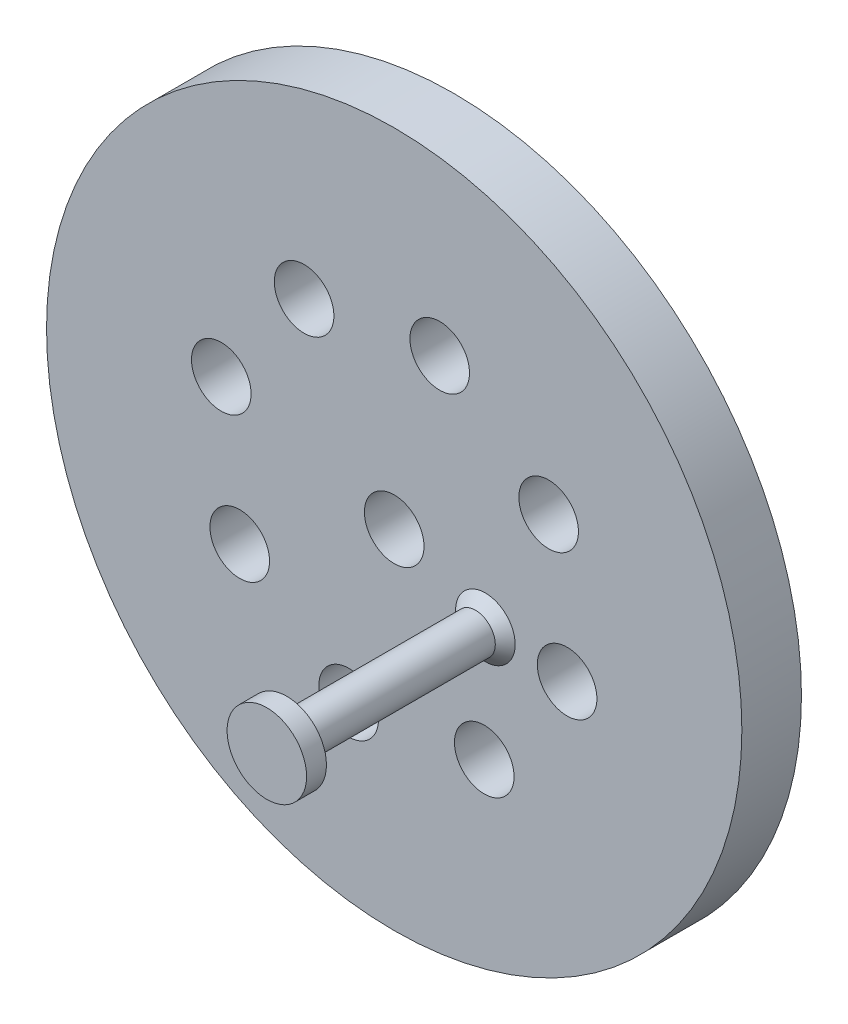
ISO-10303-21;
HEADER;
FILE_DESCRIPTION(('STEP AP214'),'2;1');
FILE_NAME('part.step','',(''),(''),'','','');
FILE_SCHEMA(('AUTOMOTIVE_DESIGN { 1 0 10303 214 1 1 1 1 }'));
ENDSEC;
DATA;
#1=APPLICATION_CONTEXT('core data for automotive mechanical design processes');
#2=APPLICATION_PROTOCOL_DEFINITION('international standard','automotive_design',2000,#1);
#3=PRODUCT_CONTEXT('',#1,'mechanical');
#4=PRODUCT('Part','Part','',(#3));
#5=PRODUCT_RELATED_PRODUCT_CATEGORY('part','',(#4));
#6=PRODUCT_DEFINITION_FORMATION('','',#4);
#7=PRODUCT_DEFINITION_CONTEXT('part definition',#1,'design');
#8=PRODUCT_DEFINITION('design','',#6,#7);
#9=PRODUCT_DEFINITION_SHAPE('','',#8);
#10=(LENGTH_UNIT() NAMED_UNIT(*) SI_UNIT(.MILLI.,.METRE.));
#11=(NAMED_UNIT(*) PLANE_ANGLE_UNIT() SI_UNIT($,.RADIAN.));
#12=(NAMED_UNIT(*) SI_UNIT($,.STERADIAN.) SOLID_ANGLE_UNIT());
#13=UNCERTAINTY_MEASURE_WITH_UNIT(LENGTH_MEASURE(1.E-05),#10,'distance_accuracy_value','');
#14=(GEOMETRIC_REPRESENTATION_CONTEXT(3) GLOBAL_UNCERTAINTY_ASSIGNED_CONTEXT((#13)) GLOBAL_UNIT_ASSIGNED_CONTEXT((#10,
#11,#12)) REPRESENTATION_CONTEXT('',''));
#15=CARTESIAN_POINT('',(0.,0.,0.));
#16=DIRECTION('',(0.,0.,1.));
#17=DIRECTION('',(1.,0.,0.));
#18=AXIS2_PLACEMENT_3D('',#15,#16,#17);
#19=CARTESIAN_POINT('',(9.17867077053944,-3.96887929849786,28.));
#20=DIRECTION('',(0.,0.,-1.));
#21=DIRECTION('',(-1.,0.,0.));
#22=AXIS2_PLACEMENT_3D('',#19,#20,#21);
#23=CYLINDRICAL_SURFACE('',#22,2.);
#24=CARTESIAN_POINT('',(9.17867077053944,-3.96887929849786,6.99999999999997));
#25=DIRECTION('',(0.,0.,1.));
#26=DIRECTION('',(1.,0.,0.));
#27=AXIS2_PLACEMENT_3D('',#24,#25,#26);
#28=CIRCLE('',#27,2.);
#29=CARTESIAN_POINT('',(11.1786707705394,-3.96887929849786,6.99999999999997));
#30=VERTEX_POINT('',#29);
#31=EDGE_CURVE('E67',#30,#30,#28,.T.);
#32=ORIENTED_EDGE('',*,*,#31,.T.);
#33=EDGE_LOOP('',(#32));
#34=FACE_BOUND('',#33,.T.);
#35=CARTESIAN_POINT('',(9.17867077053944,-3.96887929849786,26.));
#36=DIRECTION('',(0.,0.,1.));
#37=DIRECTION('',(1.,0.,0.));
#38=AXIS2_PLACEMENT_3D('',#35,#36,#37);
#39=CIRCLE('',#38,2.);
#40=CARTESIAN_POINT('',(11.1786707705394,-3.96887929849786,26.));
#41=VERTEX_POINT('',#40);
#42=EDGE_CURVE('E74',#41,#41,#39,.T.);
#43=ORIENTED_EDGE('',*,*,#42,.F.);
#44=EDGE_LOOP('',(#43));
#45=FACE_BOUND('',#44,.T.);
#46=ADVANCED_FACE('F58',(#34,#45),#23,.T.);
#47=CARTESIAN_POINT('',(0.,0.,6.));
#48=DIRECTION('',(0.,0.,1.));
#49=DIRECTION('',(1.,0.,0.));
#50=AXIS2_PLACEMENT_3D('',#47,#48,#49);
#51=PLANE('',#50);
#52=CARTESIAN_POINT('',(9.17867077053944,-3.96887929849786,6.));
#53=DIRECTION('',(0.,0.,1.));
#54=DIRECTION('',(1.,0.,0.));
#55=AXIS2_PLACEMENT_3D('',#52,#53,#54);
#56=CIRCLE('',#55,2.99999999999996);
#57=CARTESIAN_POINT('',(12.1786707705394,-3.96887929849786,6.));
#58=VERTEX_POINT('',#57);
#59=EDGE_CURVE('E10',#58,#58,#56,.F.);
#60=ORIENTED_EDGE('',*,*,#59,.T.);
#61=EDGE_LOOP('',(#60));
#62=FACE_BOUND('',#61,.T.);
#63=CARTESIAN_POINT('',(15.548658842396,9.06858358305098,6.));
#64=DIRECTION('',(0.,0.,-1.));
#65=DIRECTION('',(-1.,0.,0.));
#66=AXIS2_PLACEMENT_3D('',#63,#64,#65);
#67=CIRCLE('',#66,3.);
#68=CARTESIAN_POINT('',(12.548658842396,9.06858358305098,6.));
#69=VERTEX_POINT('',#68);
#70=EDGE_CURVE('E108',#69,#69,#67,.T.);
#71=ORIENTED_EDGE('',*,*,#70,.T.);
#72=EDGE_LOOP('',(#71));
#73=FACE_BOUND('',#72,.T.);
#74=CARTESIAN_POINT('',(17.4070190531467,-4.58210515848203,6.));
#75=DIRECTION('',(0.,0.,-1.));
#76=DIRECTION('',(-1.,0.,0.));
#77=AXIS2_PLACEMENT_3D('',#74,#75,#76);
#78=CIRCLE('',#77,3.);
#79=CARTESIAN_POINT('',(14.4070190531467,-4.58210515848203,6.));
#80=VERTEX_POINT('',#79);
#81=EDGE_CURVE('E117',#80,#80,#78,.T.);
#82=ORIENTED_EDGE('',*,*,#81,.T.);
#83=EDGE_LOOP('',(#82));
#84=FACE_BOUND('',#83,.T.);
#85=CARTESIAN_POINT('',(9.06858358305099,-15.5486588423959,6.));
#86=DIRECTION('',(0.,0.,-1.));
#87=DIRECTION('',(-1.,0.,0.));
#88=AXIS2_PLACEMENT_3D('',#85,#86,#87);
#89=CIRCLE('',#88,3.);
#90=CARTESIAN_POINT('',(6.06858358305099,-15.5486588423959,6.));
#91=VERTEX_POINT('',#90);
#92=EDGE_CURVE('E125',#91,#91,#89,.T.);
#93=ORIENTED_EDGE('',*,*,#92,.T.);
#94=EDGE_LOOP('',(#93));
#95=FACE_BOUND('',#94,.T.);
#96=CARTESIAN_POINT('',(-4.58210515848203,-17.4070190531467,6.));
#97=DIRECTION('',(0.,0.,-1.));
#98=DIRECTION('',(-1.,0.,0.));
#99=AXIS2_PLACEMENT_3D('',#96,#97,#98);
#100=CIRCLE('',#99,3.);
#101=CARTESIAN_POINT('',(-7.58210515848203,-17.4070190531467,6.));
#102=VERTEX_POINT('',#101);
#103=EDGE_CURVE('E133',#102,#102,#100,.T.);
#104=ORIENTED_EDGE('',*,*,#103,.T.);
#105=EDGE_LOOP('',(#104));
#106=FACE_BOUND('',#105,.T.);
#107=CARTESIAN_POINT('',(-15.548658842396,-9.06858358305097,6.));
#108=DIRECTION('',(0.,0.,-1.));
#109=DIRECTION('',(-1.,0.,0.));
#110=AXIS2_PLACEMENT_3D('',#107,#108,#109);
#111=CIRCLE('',#110,3.);
#112=CARTESIAN_POINT('',(-18.548658842396,-9.06858358305097,6.));
#113=VERTEX_POINT('',#112);
#114=EDGE_CURVE('E141',#113,#113,#111,.T.);
#115=ORIENTED_EDGE('',*,*,#114,.T.);
#116=EDGE_LOOP('',(#115));
#117=FACE_BOUND('',#116,.T.);
#118=CARTESIAN_POINT('',(-17.4070190531467,4.58210515848202,6.));
#119=DIRECTION('',(0.,0.,-1.));
#120=DIRECTION('',(-1.,0.,0.));
#121=AXIS2_PLACEMENT_3D('',#118,#119,#120);
#122=CIRCLE('',#121,2.99999999999999);
#123=CARTESIAN_POINT('',(-20.4070190531467,4.58210515848202,6.));
#124=VERTEX_POINT('',#123);
#125=EDGE_CURVE('E149',#124,#124,#122,.T.);
#126=ORIENTED_EDGE('',*,*,#125,.T.);
#127=EDGE_LOOP('',(#126));
#128=FACE_BOUND('',#127,.T.);
#129=CARTESIAN_POINT('',(-9.06858358305098,15.548658842396,6.));
#130=DIRECTION('',(0.,0.,-1.));
#131=DIRECTION('',(-1.,0.,0.));
#132=AXIS2_PLACEMENT_3D('',#129,#130,#131);
#133=CIRCLE('',#132,3.);
#134=CARTESIAN_POINT('',(-12.068583583051,15.548658842396,6.));
#135=VERTEX_POINT('',#134);
#136=EDGE_CURVE('E157',#135,#135,#133,.T.);
#137=ORIENTED_EDGE('',*,*,#136,.T.);
#138=EDGE_LOOP('',(#137));
#139=FACE_BOUND('',#138,.T.);
#140=CARTESIAN_POINT('',(4.58210515848201,17.4070190531467,6.));
#141=DIRECTION('',(0.,0.,-1.));
#142=DIRECTION('',(-1.,0.,0.));
#143=AXIS2_PLACEMENT_3D('',#140,#141,#142);
#144=CIRCLE('',#143,3.);
#145=CARTESIAN_POINT('',(1.58210515848201,17.4070190531467,6.));
#146=VERTEX_POINT('',#145);
#147=EDGE_CURVE('E96',#146,#146,#144,.T.);
#148=ORIENTED_EDGE('',*,*,#147,.T.);
#149=EDGE_LOOP('',(#148));
#150=FACE_BOUND('',#149,.T.);
#151=CARTESIAN_POINT('',(0.,0.,6.));
#152=DIRECTION('',(0.,0.,1.));
#153=DIRECTION('',(1.,0.,0.));
#154=AXIS2_PLACEMENT_3D('',#151,#152,#153);
#155=CIRCLE('',#154,35.);
#156=CARTESIAN_POINT('',(35.,0.,6.));
#157=VERTEX_POINT('',#156);
#158=EDGE_CURVE('E81',#157,#157,#155,.T.);
#159=ORIENTED_EDGE('',*,*,#158,.T.);
#160=EDGE_LOOP('',(#159));
#161=FACE_BOUND('',#160,.T.);
#162=CARTESIAN_POINT('',(0.,0.,6.));
#163=DIRECTION('',(0.,0.,1.));
#164=DIRECTION('',(1.,0.,0.));
#165=AXIS2_PLACEMENT_3D('',#162,#163,#164);
#166=CIRCLE('',#165,3.);
#167=CARTESIAN_POINT('',(3.,0.,6.));
#168=VERTEX_POINT('',#167);
#169=EDGE_CURVE('E88',#168,#168,#166,.T.);
#170=ORIENTED_EDGE('',*,*,#169,.F.);
#171=EDGE_LOOP('',(#170));
#172=FACE_BOUND('',#171,.T.);
#173=ADVANCED_FACE('F190',(#62,#73,#84,#95,#106,#117,#128,#139,#150,#161,#172),#51,.T.);
#174=CARTESIAN_POINT('',(0.,0.,0.));
#175=DIRECTION('',(0.,0.,1.));
#176=DIRECTION('',(1.,0.,0.));
#177=AXIS2_PLACEMENT_3D('',#174,#175,#176);
#178=PLANE('',#177);
#179=CARTESIAN_POINT('',(15.548658842396,9.06858358305098,0.));
#180=DIRECTION('',(0.,0.,-1.));
#181=DIRECTION('',(-1.,0.,0.));
#182=AXIS2_PLACEMENT_3D('',#179,#180,#181);
#183=CIRCLE('',#182,3.);
#184=CARTESIAN_POINT('',(12.548658842396,9.06858358305098,0.));
#185=VERTEX_POINT('',#184);
#186=EDGE_CURVE('E112',#185,#185,#183,.T.);
#187=ORIENTED_EDGE('',*,*,#186,.F.);
#188=EDGE_LOOP('',(#187));
#189=FACE_BOUND('',#188,.T.);
#190=CARTESIAN_POINT('',(17.4070190531467,-4.58210515848203,0.));
#191=DIRECTION('',(0.,0.,-1.));
#192=DIRECTION('',(-1.,0.,0.));
#193=AXIS2_PLACEMENT_3D('',#190,#191,#192);
#194=CIRCLE('',#193,3.);
#195=CARTESIAN_POINT('',(14.4070190531467,-4.58210515848203,0.));
#196=VERTEX_POINT('',#195);
#197=EDGE_CURVE('E121',#196,#196,#194,.T.);
#198=ORIENTED_EDGE('',*,*,#197,.F.);
#199=EDGE_LOOP('',(#198));
#200=FACE_BOUND('',#199,.T.);
#201=CARTESIAN_POINT('',(9.06858358305099,-15.5486588423959,0.));
#202=DIRECTION('',(0.,0.,-1.));
#203=DIRECTION('',(-1.,0.,0.));
#204=AXIS2_PLACEMENT_3D('',#201,#202,#203);
#205=CIRCLE('',#204,3.);
#206=CARTESIAN_POINT('',(6.06858358305099,-15.5486588423959,0.));
#207=VERTEX_POINT('',#206);
#208=EDGE_CURVE('E129',#207,#207,#205,.T.);
#209=ORIENTED_EDGE('',*,*,#208,.F.);
#210=EDGE_LOOP('',(#209));
#211=FACE_BOUND('',#210,.T.);
#212=CARTESIAN_POINT('',(-4.58210515848203,-17.4070190531467,0.));
#213=DIRECTION('',(0.,0.,-1.));
#214=DIRECTION('',(-1.,0.,0.));
#215=AXIS2_PLACEMENT_3D('',#212,#213,#214);
#216=CIRCLE('',#215,3.);
#217=CARTESIAN_POINT('',(-7.58210515848203,-17.4070190531467,0.));
#218=VERTEX_POINT('',#217);
#219=EDGE_CURVE('E137',#218,#218,#216,.T.);
#220=ORIENTED_EDGE('',*,*,#219,.F.);
#221=EDGE_LOOP('',(#220));
#222=FACE_BOUND('',#221,.T.);
#223=CARTESIAN_POINT('',(-15.548658842396,-9.06858358305097,0.));
#224=DIRECTION('',(0.,0.,-1.));
#225=DIRECTION('',(-1.,0.,0.));
#226=AXIS2_PLACEMENT_3D('',#223,#224,#225);
#227=CIRCLE('',#226,3.);
#228=CARTESIAN_POINT('',(-18.548658842396,-9.06858358305097,0.));
#229=VERTEX_POINT('',#228);
#230=EDGE_CURVE('E145',#229,#229,#227,.T.);
#231=ORIENTED_EDGE('',*,*,#230,.F.);
#232=EDGE_LOOP('',(#231));
#233=FACE_BOUND('',#232,.T.);
#234=CARTESIAN_POINT('',(-17.4070190531467,4.58210515848202,0.));
#235=DIRECTION('',(0.,0.,-1.));
#236=DIRECTION('',(-1.,0.,0.));
#237=AXIS2_PLACEMENT_3D('',#234,#235,#236);
#238=CIRCLE('',#237,2.99999999999999);
#239=CARTESIAN_POINT('',(-20.4070190531467,4.58210515848202,0.));
#240=VERTEX_POINT('',#239);
#241=EDGE_CURVE('E153',#240,#240,#238,.T.);
#242=ORIENTED_EDGE('',*,*,#241,.F.);
#243=EDGE_LOOP('',(#242));
#244=FACE_BOUND('',#243,.T.);
#245=CARTESIAN_POINT('',(-9.06858358305098,15.548658842396,0.));
#246=DIRECTION('',(0.,0.,-1.));
#247=DIRECTION('',(-1.,0.,0.));
#248=AXIS2_PLACEMENT_3D('',#245,#246,#247);
#249=CIRCLE('',#248,3.);
#250=CARTESIAN_POINT('',(-12.068583583051,15.548658842396,0.));
#251=VERTEX_POINT('',#250);
#252=EDGE_CURVE('E104',#251,#251,#249,.T.);
#253=ORIENTED_EDGE('',*,*,#252,.F.);
#254=EDGE_LOOP('',(#253));
#255=FACE_BOUND('',#254,.T.);
#256=CARTESIAN_POINT('',(4.58210515848201,17.4070190531467,0.));
#257=DIRECTION('',(0.,0.,-1.));
#258=DIRECTION('',(-1.,0.,0.));
#259=AXIS2_PLACEMENT_3D('',#256,#257,#258);
#260=CIRCLE('',#259,3.);
#261=CARTESIAN_POINT('',(1.58210515848201,17.4070190531467,0.));
#262=VERTEX_POINT('',#261);
#263=EDGE_CURVE('E100',#262,#262,#260,.T.);
#264=ORIENTED_EDGE('',*,*,#263,.F.);
#265=EDGE_LOOP('',(#264));
#266=FACE_BOUND('',#265,.T.);
#267=CARTESIAN_POINT('',(0.,0.,0.));
#268=DIRECTION('',(0.,0.,1.));
#269=DIRECTION('',(1.,0.,0.));
#270=AXIS2_PLACEMENT_3D('',#267,#268,#269);
#271=CIRCLE('',#270,35.);
#272=CARTESIAN_POINT('',(35.,0.,0.));
#273=VERTEX_POINT('',#272);
#274=EDGE_CURVE('E84',#273,#273,#271,.T.);
#275=ORIENTED_EDGE('',*,*,#274,.F.);
#276=EDGE_LOOP('',(#275));
#277=FACE_BOUND('',#276,.T.);
#278=CARTESIAN_POINT('',(0.,0.,0.));
#279=DIRECTION('',(0.,0.,1.));
#280=DIRECTION('',(1.,0.,0.));
#281=AXIS2_PLACEMENT_3D('',#278,#279,#280);
#282=CIRCLE('',#281,3.);
#283=CARTESIAN_POINT('',(3.,0.,0.));
#284=VERTEX_POINT('',#283);
#285=EDGE_CURVE('E92',#284,#284,#282,.T.);
#286=ORIENTED_EDGE('',*,*,#285,.T.);
#287=EDGE_LOOP('',(#286));
#288=FACE_BOUND('',#287,.T.);
#289=ADVANCED_FACE('F195',(#189,#200,#211,#222,#233,#244,#255,#266,#277,#288),#178,.F.);
#290=CARTESIAN_POINT('',(0.,0.,6.));
#291=DIRECTION('',(0.,0.,-1.));
#292=DIRECTION('',(-1.,0.,0.));
#293=AXIS2_PLACEMENT_3D('',#290,#291,#292);
#294=CYLINDRICAL_SURFACE('',#293,35.);
#295=ORIENTED_EDGE('',*,*,#158,.F.);
#296=EDGE_LOOP('',(#295));
#297=FACE_BOUND('',#296,.T.);
#298=ORIENTED_EDGE('',*,*,#274,.T.);
#299=EDGE_LOOP('',(#298));
#300=FACE_BOUND('',#299,.T.);
#301=ADVANCED_FACE('F232',(#297,#300),#294,.T.);
#302=CARTESIAN_POINT('',(0.,0.,6.));
#303=DIRECTION('',(0.,0.,-1.));
#304=DIRECTION('',(-1.,0.,0.));
#305=AXIS2_PLACEMENT_3D('',#302,#303,#304);
#306=CYLINDRICAL_SURFACE('',#305,3.);
#307=ORIENTED_EDGE('',*,*,#169,.T.);
#308=EDGE_LOOP('',(#307));
#309=FACE_BOUND('',#308,.T.);
#310=ORIENTED_EDGE('',*,*,#285,.F.);
#311=EDGE_LOOP('',(#310));
#312=FACE_BOUND('',#311,.T.);
#313=ADVANCED_FACE('F229',(#309,#312),#306,.F.);
#314=CARTESIAN_POINT('',(4.58210515848201,17.4070190531467,6.));
#315=DIRECTION('',(0.,0.,-1.));
#316=DIRECTION('',(-1.,0.,0.));
#317=AXIS2_PLACEMENT_3D('',#314,#315,#316);
#318=CYLINDRICAL_SURFACE('',#317,3.);
#319=ORIENTED_EDGE('',*,*,#147,.F.);
#320=EDGE_LOOP('',(#319));
#321=FACE_BOUND('',#320,.T.);
#322=ORIENTED_EDGE('',*,*,#263,.T.);
#323=EDGE_LOOP('',(#322));
#324=FACE_BOUND('',#323,.T.);
#325=ADVANCED_FACE('F203',(#321,#324),#318,.F.);
#326=CARTESIAN_POINT('',(-9.06858358305098,15.548658842396,6.));
#327=DIRECTION('',(0.,0.,-1.));
#328=DIRECTION('',(-1.,0.,0.));
#329=AXIS2_PLACEMENT_3D('',#326,#327,#328);
#330=CYLINDRICAL_SURFACE('',#329,3.);
#331=ORIENTED_EDGE('',*,*,#136,.F.);
#332=EDGE_LOOP('',(#331));
#333=FACE_BOUND('',#332,.T.);
#334=ORIENTED_EDGE('',*,*,#252,.T.);
#335=EDGE_LOOP('',(#334));
#336=FACE_BOUND('',#335,.T.);
#337=ADVANCED_FACE('F199',(#333,#336),#330,.F.);
#338=CARTESIAN_POINT('',(-17.4070190531467,4.58210515848202,6.));
#339=DIRECTION('',(0.,0.,-1.));
#340=DIRECTION('',(-1.,0.,0.));
#341=AXIS2_PLACEMENT_3D('',#338,#339,#340);
#342=CYLINDRICAL_SURFACE('',#341,2.99999999999999);
#343=ORIENTED_EDGE('',*,*,#125,.F.);
#344=EDGE_LOOP('',(#343));
#345=FACE_BOUND('',#344,.T.);
#346=ORIENTED_EDGE('',*,*,#241,.T.);
#347=EDGE_LOOP('',(#346));
#348=FACE_BOUND('',#347,.T.);
#349=ADVANCED_FACE('F202',(#345,#348),#342,.F.);
#350=CARTESIAN_POINT('',(-15.548658842396,-9.06858358305097,6.));
#351=DIRECTION('',(0.,0.,-1.));
#352=DIRECTION('',(-1.,0.,0.));
#353=AXIS2_PLACEMENT_3D('',#350,#351,#352);
#354=CYLINDRICAL_SURFACE('',#353,3.);
#355=ORIENTED_EDGE('',*,*,#114,.F.);
#356=EDGE_LOOP('',(#355));
#357=FACE_BOUND('',#356,.T.);
#358=ORIENTED_EDGE('',*,*,#230,.T.);
#359=EDGE_LOOP('',(#358));
#360=FACE_BOUND('',#359,.T.);
#361=ADVANCED_FACE('F207',(#357,#360),#354,.F.);
#362=CARTESIAN_POINT('',(-4.58210515848203,-17.4070190531467,6.));
#363=DIRECTION('',(0.,0.,-1.));
#364=DIRECTION('',(-1.,0.,0.));
#365=AXIS2_PLACEMENT_3D('',#362,#363,#364);
#366=CYLINDRICAL_SURFACE('',#365,3.);
#367=ORIENTED_EDGE('',*,*,#103,.F.);
#368=EDGE_LOOP('',(#367));
#369=FACE_BOUND('',#368,.T.);
#370=ORIENTED_EDGE('',*,*,#219,.T.);
#371=EDGE_LOOP('',(#370));
#372=FACE_BOUND('',#371,.T.);
#373=ADVANCED_FACE('F211',(#369,#372),#366,.F.);
#374=CARTESIAN_POINT('',(9.06858358305099,-15.5486588423959,6.));
#375=DIRECTION('',(0.,0.,-1.));
#376=DIRECTION('',(-1.,0.,0.));
#377=AXIS2_PLACEMENT_3D('',#374,#375,#376);
#378=CYLINDRICAL_SURFACE('',#377,3.);
#379=ORIENTED_EDGE('',*,*,#92,.F.);
#380=EDGE_LOOP('',(#379));
#381=FACE_BOUND('',#380,.T.);
#382=ORIENTED_EDGE('',*,*,#208,.T.);
#383=EDGE_LOOP('',(#382));
#384=FACE_BOUND('',#383,.T.);
#385=ADVANCED_FACE('F215',(#381,#384),#378,.F.);
#386=CARTESIAN_POINT('',(17.4070190531467,-4.58210515848203,6.));
#387=DIRECTION('',(0.,0.,-1.));
#388=DIRECTION('',(-1.,0.,0.));
#389=AXIS2_PLACEMENT_3D('',#386,#387,#388);
#390=CYLINDRICAL_SURFACE('',#389,3.);
#391=ORIENTED_EDGE('',*,*,#81,.F.);
#392=EDGE_LOOP('',(#391));
#393=FACE_BOUND('',#392,.T.);
#394=ORIENTED_EDGE('',*,*,#197,.T.);
#395=EDGE_LOOP('',(#394));
#396=FACE_BOUND('',#395,.T.);
#397=ADVANCED_FACE('F219',(#393,#396),#390,.F.);
#398=CARTESIAN_POINT('',(15.548658842396,9.06858358305098,6.));
#399=DIRECTION('',(0.,0.,-1.));
#400=DIRECTION('',(-1.,0.,0.));
#401=AXIS2_PLACEMENT_3D('',#398,#399,#400);
#402=CYLINDRICAL_SURFACE('',#401,3.);
#403=ORIENTED_EDGE('',*,*,#70,.F.);
#404=EDGE_LOOP('',(#403));
#405=FACE_BOUND('',#404,.T.);
#406=ORIENTED_EDGE('',*,*,#186,.T.);
#407=EDGE_LOOP('',(#406));
#408=FACE_BOUND('',#407,.T.);
#409=ADVANCED_FACE('F187',(#405,#408),#402,.F.);
#410=CARTESIAN_POINT('',(9.17867077053944,-3.96887929849786,26.));
#411=DIRECTION('',(0.,0.,1.));
#412=DIRECTION('',(1.,0.,0.));
#413=AXIS2_PLACEMENT_3D('',#410,#411,#412);
#414=CYLINDRICAL_SURFACE('',#413,4.);
#415=CARTESIAN_POINT('',(9.17867077053944,-3.96887929849786,26.));
#416=DIRECTION('',(0.,0.,1.));
#417=DIRECTION('',(1.,0.,0.));
#418=AXIS2_PLACEMENT_3D('',#415,#416,#417);
#419=CIRCLE('',#418,4.);
#420=CARTESIAN_POINT('',(13.1786707705394,-3.96887929849786,26.));
#421=VERTEX_POINT('',#420);
#422=EDGE_CURVE('E113',#421,#421,#419,.T.);
#423=ORIENTED_EDGE('',*,*,#422,.T.);
#424=EDGE_LOOP('',(#423));
#425=FACE_BOUND('',#424,.T.);
#426=CARTESIAN_POINT('',(9.17867077053944,-3.96887929849786,28.));
#427=DIRECTION('',(0.,0.,1.));
#428=DIRECTION('',(1.,0.,0.));
#429=AXIS2_PLACEMENT_3D('',#426,#427,#428);
#430=CIRCLE('',#429,4.);
#431=CARTESIAN_POINT('',(13.1786707705394,-3.96887929849786,28.));
#432=VERTEX_POINT('',#431);
#433=EDGE_CURVE('E164',#432,#432,#430,.T.);
#434=ORIENTED_EDGE('',*,*,#433,.F.);
#435=EDGE_LOOP('',(#434));
#436=FACE_BOUND('',#435,.T.);
#437=ADVANCED_FACE('F174',(#425,#436),#414,.T.);
#438=CARTESIAN_POINT('',(9.17867077053944,-3.96887929849786,26.));
#439=DIRECTION('',(0.,0.,1.));
#440=DIRECTION('',(1.,0.,0.));
#441=AXIS2_PLACEMENT_3D('',#438,#439,#440);
#442=PLANE('',#441);
#443=ORIENTED_EDGE('',*,*,#42,.T.);
#444=EDGE_LOOP('',(#443));
#445=FACE_BOUND('',#444,.T.);
#446=ORIENTED_EDGE('',*,*,#422,.F.);
#447=EDGE_LOOP('',(#446));
#448=FACE_BOUND('',#447,.T.);
#449=ADVANCED_FACE('F177',(#445,#448),#442,.F.);
#450=CARTESIAN_POINT('',(9.17867077053944,-3.96887929849786,28.));
#451=DIRECTION('',(0.,0.,1.));
#452=DIRECTION('',(1.,0.,0.));
#453=AXIS2_PLACEMENT_3D('',#450,#451,#452);
#454=PLANE('',#453);
#455=ORIENTED_EDGE('',*,*,#433,.T.);
#456=EDGE_LOOP('',(#455));
#457=FACE_BOUND('',#456,.T.);
#458=ADVANCED_FACE('F179',(#457),#454,.T.);
#459=CARTESIAN_POINT('',(9.17867077053944,-3.96887929849786,6.99999999999997));
#460=DIRECTION('',(0.,0.,-1.));
#461=DIRECTION('',(-1.,0.,0.));
#462=AXIS2_PLACEMENT_3D('',#459,#460,#461);
#463=CONICAL_SURFACE('',#462,2.,0.785398163397444);
#464=ORIENTED_EDGE('',*,*,#59,.F.);
#465=EDGE_LOOP('',(#464));
#466=FACE_BOUND('',#465,.T.);
#467=ORIENTED_EDGE('',*,*,#31,.F.);
#468=EDGE_LOOP('',(#467));
#469=FACE_BOUND('',#468,.T.);
#470=ADVANCED_FACE('F61',(#466,#469),#463,.T.);
#471=CLOSED_SHELL('',(#46,#173,#289,#301,#313,#325,#337,#349,#361,#373,#385,#397,#409,#437,#449,
#458,#470));
#472=MANIFOLD_SOLID_BREP('B2',#471);
#473=ADVANCED_BREP_SHAPE_REPRESENTATION('',(#18,#472),#14);
#474=SHAPE_DEFINITION_REPRESENTATION(#9,#473);
ENDSEC;
END-ISO-10303-21;
